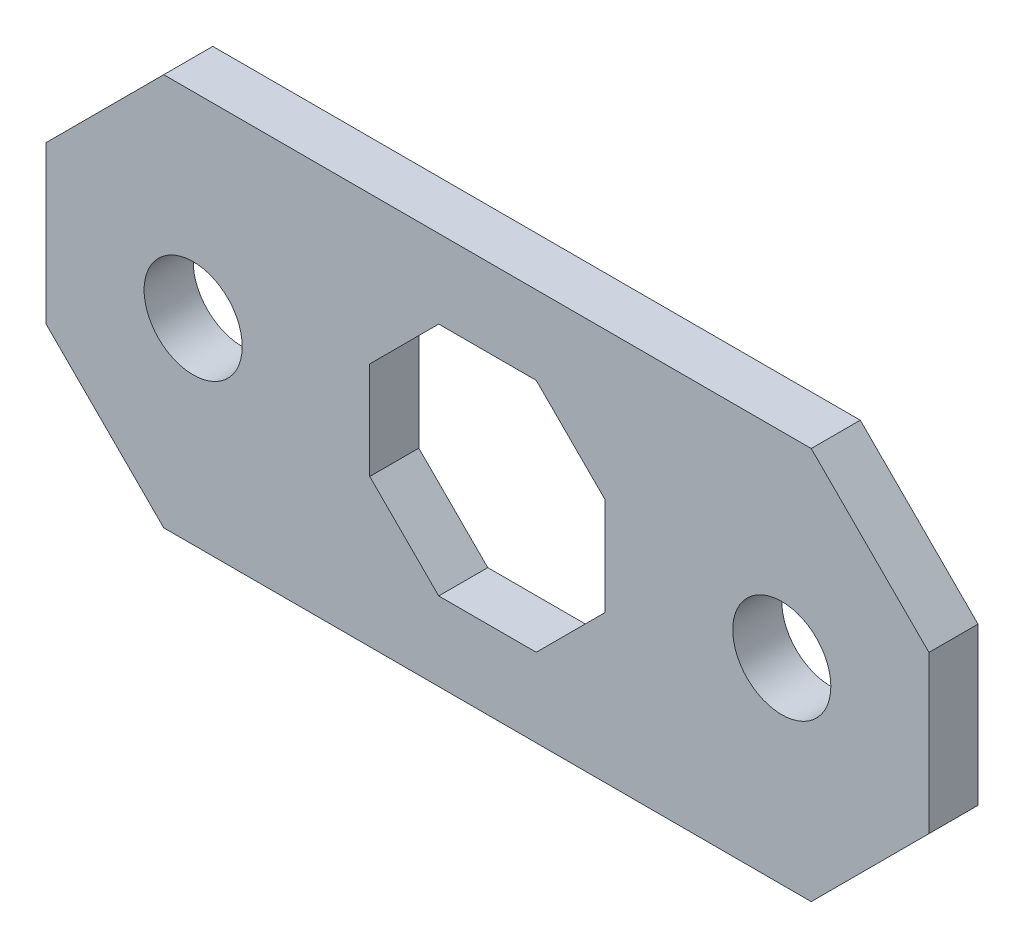
ISO-10303-21;
HEADER;
FILE_DESCRIPTION(('STEP AP214'),'2;1');
FILE_NAME('part.step','',(''),(''),'','','');
FILE_SCHEMA(('AUTOMOTIVE_DESIGN { 1 0 10303 214 1 1 1 1 }'));
ENDSEC;
DATA;
#1=APPLICATION_CONTEXT('core data for automotive mechanical design processes');
#2=APPLICATION_PROTOCOL_DEFINITION('international standard','automotive_design',2000,#1);
#3=PRODUCT_CONTEXT('',#1,'mechanical');
#4=PRODUCT('Part','Part','',(#3));
#5=PRODUCT_RELATED_PRODUCT_CATEGORY('part','',(#4));
#6=PRODUCT_DEFINITION_FORMATION('','',#4);
#7=PRODUCT_DEFINITION_CONTEXT('part definition',#1,'design');
#8=PRODUCT_DEFINITION('design','',#6,#7);
#9=PRODUCT_DEFINITION_SHAPE('','',#8);
#10=(LENGTH_UNIT() NAMED_UNIT(*) SI_UNIT(.MILLI.,.METRE.));
#11=(NAMED_UNIT(*) PLANE_ANGLE_UNIT() SI_UNIT($,.RADIAN.));
#12=(NAMED_UNIT(*) SI_UNIT($,.STERADIAN.) SOLID_ANGLE_UNIT());
#13=UNCERTAINTY_MEASURE_WITH_UNIT(LENGTH_MEASURE(1.E-05),#10,'distance_accuracy_value','');
#14=(GEOMETRIC_REPRESENTATION_CONTEXT(3) GLOBAL_UNCERTAINTY_ASSIGNED_CONTEXT((#13)) GLOBAL_UNIT_ASSIGNED_CONTEXT((#10,
#11,#12)) REPRESENTATION_CONTEXT('',''));
#15=CARTESIAN_POINT('',(0.,0.,0.));
#16=DIRECTION('',(0.,0.,1.));
#17=DIRECTION('',(1.,0.,0.));
#18=AXIS2_PLACEMENT_3D('',#15,#16,#17);
#19=CARTESIAN_POINT('',(28.575,-12.7,3.175));
#20=DIRECTION('',(-1.,0.,0.));
#21=DIRECTION('',(0.,0.,1.));
#22=AXIS2_PLACEMENT_3D('',#19,#20,#21);
#23=PLANE('',#22);
#24=DIRECTION('',(0.,1.,0.));
#25=VECTOR('',#24,1.);
#26=CARTESIAN_POINT('',(28.575,-12.7,3.175));
#27=LINE('',#26,#25);
#28=CARTESIAN_POINT('',(28.575,-5.08,3.175));
#29=VERTEX_POINT('',#28);
#30=CARTESIAN_POINT('',(28.575,5.07999999999997,3.175));
#31=VERTEX_POINT('',#30);
#32=EDGE_CURVE('E226',#29,#31,#27,.T.);
#33=ORIENTED_EDGE('',*,*,#32,.F.);
#34=DIRECTION('',(0.,0.,-1.));
#35=VECTOR('',#34,1.);
#36=CARTESIAN_POINT('',(28.575,-5.08,3.175));
#37=LINE('',#36,#35);
#38=CARTESIAN_POINT('',(28.575,-5.07999999999999,0.));
#39=VERTEX_POINT('',#38);
#40=EDGE_CURVE('E11',#29,#39,#37,.T.);
#41=ORIENTED_EDGE('',*,*,#40,.T.);
#42=DIRECTION('',(0.,1.,0.));
#43=VECTOR('',#42,1.);
#44=CARTESIAN_POINT('',(28.575,-12.7,0.));
#45=LINE('',#44,#43);
#46=CARTESIAN_POINT('',(28.575,5.07999999999996,0.));
#47=VERTEX_POINT('',#46);
#48=EDGE_CURVE('E225',#39,#47,#45,.T.);
#49=ORIENTED_EDGE('',*,*,#48,.T.);
#50=DIRECTION('',(0.,0.,1.));
#51=VECTOR('',#50,1.);
#52=CARTESIAN_POINT('',(28.575,5.07999999999996,3.175));
#53=LINE('',#52,#51);
#54=EDGE_CURVE('E40',#47,#31,#53,.T.);
#55=ORIENTED_EDGE('',*,*,#54,.T.);
#56=EDGE_LOOP('',(#33,#41,#49,#55));
#57=FACE_BOUND('',#56,.T.);
#58=ADVANCED_FACE('F32',(#57),#23,.F.);
#59=CARTESIAN_POINT('',(-28.575,12.7,3.175));
#60=DIRECTION('',(0.,-1.,0.));
#61=DIRECTION('',(0.,0.,-1.));
#62=AXIS2_PLACEMENT_3D('',#59,#60,#61);
#63=PLANE('',#62);
#64=DIRECTION('',(-1.,0.,0.));
#65=VECTOR('',#64,1.);
#66=CARTESIAN_POINT('',(-28.575,12.7,0.));
#67=LINE('',#66,#65);
#68=CARTESIAN_POINT('',(20.955,12.7,0.));
#69=VERTEX_POINT('',#68);
#70=CARTESIAN_POINT('',(-20.955,12.7,0.));
#71=VERTEX_POINT('',#70);
#72=EDGE_CURVE('E242',#69,#71,#67,.T.);
#73=ORIENTED_EDGE('',*,*,#72,.T.);
#74=DIRECTION('',(0.,0.,1.));
#75=VECTOR('',#74,1.);
#76=CARTESIAN_POINT('',(-20.955,12.7,3.175));
#77=LINE('',#76,#75);
#78=CARTESIAN_POINT('',(-20.955,12.7,3.175));
#79=VERTEX_POINT('',#78);
#80=EDGE_CURVE('E265',#71,#79,#77,.T.);
#81=ORIENTED_EDGE('',*,*,#80,.T.);
#82=DIRECTION('',(-1.,0.,0.));
#83=VECTOR('',#82,1.);
#84=CARTESIAN_POINT('',(-28.575,12.7,3.175));
#85=LINE('',#84,#83);
#86=CARTESIAN_POINT('',(20.955,12.7,3.175));
#87=VERTEX_POINT('',#86);
#88=EDGE_CURVE('E229',#87,#79,#85,.T.);
#89=ORIENTED_EDGE('',*,*,#88,.F.);
#90=DIRECTION('',(0.,0.,-1.));
#91=VECTOR('',#90,1.);
#92=CARTESIAN_POINT('',(20.955,12.7,3.175));
#93=LINE('',#92,#91);
#94=EDGE_CURVE('E262',#87,#69,#93,.T.);
#95=ORIENTED_EDGE('',*,*,#94,.T.);
#96=EDGE_LOOP('',(#73,#81,#89,#95));
#97=FACE_BOUND('',#96,.T.);
#98=ADVANCED_FACE('F293',(#97),#63,.F.);
#99=CARTESIAN_POINT('',(-28.575,-12.7,3.175));
#100=DIRECTION('',(1.,0.,0.));
#101=DIRECTION('',(0.,0.,-1.));
#102=AXIS2_PLACEMENT_3D('',#99,#100,#101);
#103=PLANE('',#102);
#104=DIRECTION('',(0.,-1.,0.));
#105=VECTOR('',#104,1.);
#106=CARTESIAN_POINT('',(-28.575,-12.7,3.175));
#107=LINE('',#106,#105);
#108=CARTESIAN_POINT('',(-28.575,5.08,3.175));
#109=VERTEX_POINT('',#108);
#110=CARTESIAN_POINT('',(-28.575,-5.07999999999996,3.175));
#111=VERTEX_POINT('',#110);
#112=EDGE_CURVE('E233',#109,#111,#107,.T.);
#113=ORIENTED_EDGE('',*,*,#112,.F.);
#114=DIRECTION('',(0.,0.,-1.));
#115=VECTOR('',#114,1.);
#116=CARTESIAN_POINT('',(-28.575,5.08,3.175));
#117=LINE('',#116,#115);
#118=CARTESIAN_POINT('',(-28.575,5.08,0.));
#119=VERTEX_POINT('',#118);
#120=EDGE_CURVE('E251',#109,#119,#117,.T.);
#121=ORIENTED_EDGE('',*,*,#120,.T.);
#122=DIRECTION('',(0.,-1.,0.));
#123=VECTOR('',#122,1.);
#124=CARTESIAN_POINT('',(-28.575,-12.7,0.));
#125=LINE('',#124,#123);
#126=CARTESIAN_POINT('',(-28.575,-5.07999999999996,0.));
#127=VERTEX_POINT('',#126);
#128=EDGE_CURVE('E245',#119,#127,#125,.T.);
#129=ORIENTED_EDGE('',*,*,#128,.T.);
#130=DIRECTION('',(0.,0.,1.));
#131=VECTOR('',#130,1.);
#132=CARTESIAN_POINT('',(-28.575,-5.07999999999996,3.175));
#133=LINE('',#132,#131);
#134=EDGE_CURVE('E239',#127,#111,#133,.T.);
#135=ORIENTED_EDGE('',*,*,#134,.T.);
#136=EDGE_LOOP('',(#113,#121,#129,#135));
#137=FACE_BOUND('',#136,.T.);
#138=ADVANCED_FACE('F303',(#137),#103,.F.);
#139=CARTESIAN_POINT('',(-28.575,-12.7,3.175));
#140=DIRECTION('',(0.,1.,0.));
#141=DIRECTION('',(0.,0.,1.));
#142=AXIS2_PLACEMENT_3D('',#139,#140,#141);
#143=PLANE('',#142);
#144=DIRECTION('',(1.,0.,0.));
#145=VECTOR('',#144,1.);
#146=CARTESIAN_POINT('',(-28.575,-12.7,3.175));
#147=LINE('',#146,#145);
#148=CARTESIAN_POINT('',(-20.955,-12.7,3.175));
#149=VERTEX_POINT('',#148);
#150=CARTESIAN_POINT('',(20.955,-12.7,3.175));
#151=VERTEX_POINT('',#150);
#152=EDGE_CURVE('E236',#149,#151,#147,.T.);
#153=ORIENTED_EDGE('',*,*,#152,.F.);
#154=DIRECTION('',(0.,0.,-1.));
#155=VECTOR('',#154,1.);
#156=CARTESIAN_POINT('',(-20.955,-12.7,3.175));
#157=LINE('',#156,#155);
#158=CARTESIAN_POINT('',(-20.955,-12.7,0.));
#159=VERTEX_POINT('',#158);
#160=EDGE_CURVE('E277',#149,#159,#157,.T.);
#161=ORIENTED_EDGE('',*,*,#160,.T.);
#162=DIRECTION('',(1.,0.,0.));
#163=VECTOR('',#162,1.);
#164=CARTESIAN_POINT('',(-28.575,-12.7,0.));
#165=LINE('',#164,#163);
#166=CARTESIAN_POINT('',(20.955,-12.7,0.));
#167=VERTEX_POINT('',#166);
#168=EDGE_CURVE('E230',#159,#167,#165,.T.);
#169=ORIENTED_EDGE('',*,*,#168,.T.);
#170=DIRECTION('',(0.,0.,1.));
#171=VECTOR('',#170,1.);
#172=CARTESIAN_POINT('',(20.955,-12.7,3.175));
#173=LINE('',#172,#171);
#174=EDGE_CURVE('E275',#167,#151,#173,.T.);
#175=ORIENTED_EDGE('',*,*,#174,.T.);
#176=EDGE_LOOP('',(#153,#161,#169,#175));
#177=FACE_BOUND('',#176,.T.);
#178=ADVANCED_FACE('F312',(#177),#143,.F.);
#179=CARTESIAN_POINT('',(0.,0.,3.175));
#180=DIRECTION('',(0.,0.,-1.));
#181=DIRECTION('',(-1.,0.,0.));
#182=AXIS2_PLACEMENT_3D('',#179,#180,#181);
#183=PLANE('',#182);
#184=DIRECTION('',(-0.707106781186548,0.707106781186547,0.));
#185=VECTOR('',#184,1.);
#186=CARTESIAN_POINT('',(7.62,3.15630734528299,3.175));
#187=LINE('',#186,#185);
#188=CARTESIAN_POINT('',(7.62,3.15630734528299,3.175));
#189=VERTEX_POINT('',#188);
#190=CARTESIAN_POINT('',(3.15630734528298,7.62000000000001,3.175));
#191=VERTEX_POINT('',#190);
#192=EDGE_CURVE('E184',#189,#191,#187,.T.);
#193=ORIENTED_EDGE('',*,*,#192,.F.);
#194=DIRECTION('',(0.,1.,0.));
#195=VECTOR('',#194,1.);
#196=CARTESIAN_POINT('',(7.62,-3.15630734528299,3.175));
#197=LINE('',#196,#195);
#198=CARTESIAN_POINT('',(7.62,-3.15630734528299,3.175));
#199=VERTEX_POINT('',#198);
#200=EDGE_CURVE('E47',#199,#189,#197,.T.);
#201=ORIENTED_EDGE('',*,*,#200,.F.);
#202=DIRECTION('',(0.707106781186548,0.707106781186547,0.));
#203=VECTOR('',#202,1.);
#204=CARTESIAN_POINT('',(3.15630734528299,-7.62,3.175));
#205=LINE('',#204,#203);
#206=CARTESIAN_POINT('',(3.15630734528299,-7.62,3.175));
#207=VERTEX_POINT('',#206);
#208=EDGE_CURVE('E164',#207,#199,#205,.T.);
#209=ORIENTED_EDGE('',*,*,#208,.F.);
#210=DIRECTION('',(1.,0.,0.));
#211=VECTOR('',#210,1.);
#212=CARTESIAN_POINT('',(-3.15630734528299,-7.62,3.175));
#213=LINE('',#212,#211);
#214=CARTESIAN_POINT('',(-3.15630734528299,-7.62,3.175));
#215=VERTEX_POINT('',#214);
#216=EDGE_CURVE('E167',#215,#207,#213,.T.);
#217=ORIENTED_EDGE('',*,*,#216,.F.);
#218=DIRECTION('',(0.707106781186547,-0.707106781186548,0.));
#219=VECTOR('',#218,1.);
#220=CARTESIAN_POINT('',(-7.62,-3.15630734528299,3.175));
#221=LINE('',#220,#219);
#222=CARTESIAN_POINT('',(-7.62,-3.15630734528299,3.175));
#223=VERTEX_POINT('',#222);
#224=EDGE_CURVE('E195',#223,#215,#221,.T.);
#225=ORIENTED_EDGE('',*,*,#224,.F.);
#226=DIRECTION('',(0.,-1.,0.));
#227=VECTOR('',#226,1.);
#228=CARTESIAN_POINT('',(-7.62000000000001,3.15630734528299,3.175));
#229=LINE('',#228,#227);
#230=CARTESIAN_POINT('',(-7.62000000000001,3.15630734528299,3.175));
#231=VERTEX_POINT('',#230);
#232=EDGE_CURVE('E192',#231,#223,#229,.T.);
#233=ORIENTED_EDGE('',*,*,#232,.F.);
#234=DIRECTION('',(-0.707106781186547,-0.707106781186548,0.));
#235=VECTOR('',#234,1.);
#236=CARTESIAN_POINT('',(-3.15630734528299,7.62,3.175));
#237=LINE('',#236,#235);
#238=CARTESIAN_POINT('',(-3.15630734528299,7.62,3.175));
#239=VERTEX_POINT('',#238);
#240=EDGE_CURVE('E189',#239,#231,#237,.T.);
#241=ORIENTED_EDGE('',*,*,#240,.F.);
#242=DIRECTION('',(-1.,0.,0.));
#243=VECTOR('',#242,1.);
#244=CARTESIAN_POINT('',(3.15630734528298,7.62000000000001,3.175));
#245=LINE('',#244,#243);
#246=EDGE_CURVE('E186',#191,#239,#245,.T.);
#247=ORIENTED_EDGE('',*,*,#246,.F.);
#248=EDGE_LOOP('',(#193,#201,#209,#217,#225,#233,#241,#247));
#249=FACE_BOUND('',#248,.T.);
#250=CARTESIAN_POINT('',(-19.05,0.,3.175));
#251=DIRECTION('',(0.,0.,1.));
#252=DIRECTION('',(1.,0.,0.));
#253=AXIS2_PLACEMENT_3D('',#250,#251,#252);
#254=CIRCLE('',#253,3.17500000000001);
#255=CARTESIAN_POINT('',(-15.875,0.,3.175));
#256=VERTEX_POINT('',#255);
#257=EDGE_CURVE('E202',#256,#256,#254,.T.);
#258=ORIENTED_EDGE('',*,*,#257,.F.);
#259=EDGE_LOOP('',(#258));
#260=FACE_BOUND('',#259,.T.);
#261=CARTESIAN_POINT('',(19.05,0.,3.175));
#262=DIRECTION('',(0.,0.,1.));
#263=DIRECTION('',(1.,0.,0.));
#264=AXIS2_PLACEMENT_3D('',#261,#262,#263);
#265=CIRCLE('',#264,3.17500000000001);
#266=CARTESIAN_POINT('',(22.225,0.,3.175));
#267=VERTEX_POINT('',#266);
#268=EDGE_CURVE('E219',#267,#267,#265,.T.);
#269=ORIENTED_EDGE('',*,*,#268,.F.);
#270=EDGE_LOOP('',(#269));
#271=FACE_BOUND('',#270,.T.);
#272=ORIENTED_EDGE('',*,*,#88,.T.);
#273=DIRECTION('',(0.707106781186549,0.707106781186546,0.));
#274=VECTOR('',#273,1.);
#275=CARTESIAN_POINT('',(-28.575,5.08,3.175));
#276=LINE('',#275,#274);
#277=EDGE_CURVE('E273',#79,#109,#276,.F.);
#278=ORIENTED_EDGE('',*,*,#277,.T.);
#279=ORIENTED_EDGE('',*,*,#112,.T.);
#280=DIRECTION('',(-0.707106781186546,0.707106781186549,0.));
#281=VECTOR('',#280,1.);
#282=CARTESIAN_POINT('',(-20.955,-12.7,3.175));
#283=LINE('',#282,#281);
#284=EDGE_CURVE('E271',#111,#149,#283,.F.);
#285=ORIENTED_EDGE('',*,*,#284,.T.);
#286=ORIENTED_EDGE('',*,*,#152,.T.);
#287=DIRECTION('',(-0.707106781186549,-0.707106781186546,0.));
#288=VECTOR('',#287,1.);
#289=CARTESIAN_POINT('',(28.575,-5.08,3.175));
#290=LINE('',#289,#288);
#291=EDGE_CURVE('E269',#151,#29,#290,.F.);
#292=ORIENTED_EDGE('',*,*,#291,.T.);
#293=ORIENTED_EDGE('',*,*,#32,.T.);
#294=DIRECTION('',(0.707106781186546,-0.707106781186549,0.));
#295=VECTOR('',#294,1.);
#296=CARTESIAN_POINT('',(20.955,12.7,3.175));
#297=LINE('',#296,#295);
#298=EDGE_CURVE('E267',#31,#87,#297,.F.);
#299=ORIENTED_EDGE('',*,*,#298,.T.);
#300=EDGE_LOOP('',(#272,#278,#279,#285,#286,#292,#293,#299));
#301=FACE_BOUND('',#300,.T.);
#302=ADVANCED_FACE('F287',(#249,#260,#271,#301),#183,.F.);
#303=CARTESIAN_POINT('',(0.,0.,0.));
#304=DIRECTION('',(0.,0.,-1.));
#305=DIRECTION('',(-1.,0.,0.));
#306=AXIS2_PLACEMENT_3D('',#303,#304,#305);
#307=PLANE('',#306);
#308=DIRECTION('',(0.,1.,0.));
#309=VECTOR('',#308,1.);
#310=CARTESIAN_POINT('',(7.62,-3.15630734528299,0.));
#311=LINE('',#310,#309);
#312=CARTESIAN_POINT('',(7.62,-3.15630734528299,0.));
#313=VERTEX_POINT('',#312);
#314=CARTESIAN_POINT('',(7.62,3.15630734528299,0.));
#315=VERTEX_POINT('',#314);
#316=EDGE_CURVE('E147',#313,#315,#311,.T.);
#317=ORIENTED_EDGE('',*,*,#316,.T.);
#318=DIRECTION('',(-0.707106781186548,0.707106781186547,0.));
#319=VECTOR('',#318,1.);
#320=CARTESIAN_POINT('',(7.62,3.15630734528299,0.));
#321=LINE('',#320,#319);
#322=CARTESIAN_POINT('',(3.15630734528298,7.62000000000001,0.));
#323=VERTEX_POINT('',#322);
#324=EDGE_CURVE('E156',#315,#323,#321,.T.);
#325=ORIENTED_EDGE('',*,*,#324,.T.);
#326=DIRECTION('',(-1.,0.,0.));
#327=VECTOR('',#326,1.);
#328=CARTESIAN_POINT('',(3.15630734528298,7.62000000000001,0.));
#329=LINE('',#328,#327);
#330=CARTESIAN_POINT('',(-3.15630734528299,7.62,0.));
#331=VERTEX_POINT('',#330);
#332=EDGE_CURVE('E55',#323,#331,#329,.T.);
#333=ORIENTED_EDGE('',*,*,#332,.T.);
#334=DIRECTION('',(-0.707106781186547,-0.707106781186548,0.));
#335=VECTOR('',#334,1.);
#336=CARTESIAN_POINT('',(-3.15630734528299,7.62,0.));
#337=LINE('',#336,#335);
#338=CARTESIAN_POINT('',(-7.62000000000001,3.15630734528299,0.));
#339=VERTEX_POINT('',#338);
#340=EDGE_CURVE('E171',#331,#339,#337,.T.);
#341=ORIENTED_EDGE('',*,*,#340,.T.);
#342=DIRECTION('',(0.,-1.,0.));
#343=VECTOR('',#342,1.);
#344=CARTESIAN_POINT('',(-7.62000000000001,3.15630734528299,0.));
#345=LINE('',#344,#343);
#346=CARTESIAN_POINT('',(-7.62,-3.15630734528299,0.));
#347=VERTEX_POINT('',#346);
#348=EDGE_CURVE('E174',#339,#347,#345,.T.);
#349=ORIENTED_EDGE('',*,*,#348,.T.);
#350=DIRECTION('',(0.707106781186547,-0.707106781186548,0.));
#351=VECTOR('',#350,1.);
#352=CARTESIAN_POINT('',(-7.62,-3.15630734528299,0.));
#353=LINE('',#352,#351);
#354=CARTESIAN_POINT('',(-3.15630734528299,-7.62,0.));
#355=VERTEX_POINT('',#354);
#356=EDGE_CURVE('E177',#347,#355,#353,.T.);
#357=ORIENTED_EDGE('',*,*,#356,.T.);
#358=DIRECTION('',(1.,0.,0.));
#359=VECTOR('',#358,1.);
#360=CARTESIAN_POINT('',(-3.15630734528299,-7.62,0.));
#361=LINE('',#360,#359);
#362=CARTESIAN_POINT('',(3.15630734528299,-7.62,0.));
#363=VERTEX_POINT('',#362);
#364=EDGE_CURVE('E180',#355,#363,#361,.T.);
#365=ORIENTED_EDGE('',*,*,#364,.T.);
#366=DIRECTION('',(0.707106781186548,0.707106781186547,0.));
#367=VECTOR('',#366,1.);
#368=CARTESIAN_POINT('',(3.15630734528299,-7.62,0.));
#369=LINE('',#368,#367);
#370=EDGE_CURVE('E153',#363,#313,#369,.T.);
#371=ORIENTED_EDGE('',*,*,#370,.T.);
#372=EDGE_LOOP('',(#317,#325,#333,#341,#349,#357,#365,#371));
#373=FACE_BOUND('',#372,.T.);
#374=CARTESIAN_POINT('',(-19.05,0.,0.));
#375=DIRECTION('',(0.,0.,1.));
#376=DIRECTION('',(1.,0.,0.));
#377=AXIS2_PLACEMENT_3D('',#374,#375,#376);
#378=CIRCLE('',#377,3.17500000000001);
#379=CARTESIAN_POINT('',(-15.875,0.,0.));
#380=VERTEX_POINT('',#379);
#381=EDGE_CURVE('E216',#380,#380,#378,.T.);
#382=ORIENTED_EDGE('',*,*,#381,.T.);
#383=EDGE_LOOP('',(#382));
#384=FACE_BOUND('',#383,.T.);
#385=CARTESIAN_POINT('',(19.05,0.,0.));
#386=DIRECTION('',(0.,0.,1.));
#387=DIRECTION('',(1.,0.,0.));
#388=AXIS2_PLACEMENT_3D('',#385,#386,#387);
#389=CIRCLE('',#388,3.17500000000001);
#390=CARTESIAN_POINT('',(22.225,0.,0.));
#391=VERTEX_POINT('',#390);
#392=EDGE_CURVE('E222',#391,#391,#389,.T.);
#393=ORIENTED_EDGE('',*,*,#392,.T.);
#394=EDGE_LOOP('',(#393));
#395=FACE_BOUND('',#394,.T.);
#396=ORIENTED_EDGE('',*,*,#128,.F.);
#397=DIRECTION('',(-0.707106781186549,-0.707106781186546,0.));
#398=VECTOR('',#397,1.);
#399=CARTESIAN_POINT('',(-16.8274999999999,16.8275,0.));
#400=LINE('',#399,#398);
#401=EDGE_CURVE('E260',#119,#71,#400,.F.);
#402=ORIENTED_EDGE('',*,*,#401,.T.);
#403=ORIENTED_EDGE('',*,*,#72,.F.);
#404=DIRECTION('',(-0.707106781186546,0.707106781186549,0.));
#405=VECTOR('',#404,1.);
#406=CARTESIAN_POINT('',(16.8275,16.8275,0.));
#407=LINE('',#406,#405);
#408=EDGE_CURVE('E254',#69,#47,#407,.F.);
#409=ORIENTED_EDGE('',*,*,#408,.T.);
#410=ORIENTED_EDGE('',*,*,#48,.F.);
#411=DIRECTION('',(0.707106781186549,0.707106781186546,0.));
#412=VECTOR('',#411,1.);
#413=CARTESIAN_POINT('',(16.8274999999999,-16.8275,0.));
#414=LINE('',#413,#412);
#415=EDGE_CURVE('E256',#39,#167,#414,.F.);
#416=ORIENTED_EDGE('',*,*,#415,.T.);
#417=ORIENTED_EDGE('',*,*,#168,.F.);
#418=DIRECTION('',(0.707106781186546,-0.707106781186549,0.));
#419=VECTOR('',#418,1.);
#420=CARTESIAN_POINT('',(-16.8275,-16.8275,0.));
#421=LINE('',#420,#419);
#422=EDGE_CURVE('E258',#159,#127,#421,.F.);
#423=ORIENTED_EDGE('',*,*,#422,.T.);
#424=EDGE_LOOP('',(#396,#402,#403,#409,#410,#416,#417,#423));
#425=FACE_BOUND('',#424,.T.);
#426=ADVANCED_FACE('F160',(#373,#384,#395,#425),#307,.T.);
#427=CARTESIAN_POINT('',(19.05,0.,3.175));
#428=DIRECTION('',(0.,0.,1.));
#429=DIRECTION('',(1.,0.,0.));
#430=AXIS2_PLACEMENT_3D('',#427,#428,#429);
#431=CYLINDRICAL_SURFACE('',#430,3.17500000000001);
#432=ORIENTED_EDGE('',*,*,#392,.F.);
#433=EDGE_LOOP('',(#432));
#434=FACE_BOUND('',#433,.T.);
#435=ORIENTED_EDGE('',*,*,#268,.T.);
#436=EDGE_LOOP('',(#435));
#437=FACE_BOUND('',#436,.T.);
#438=ADVANCED_FACE('F335',(#434,#437),#431,.F.);
#439=CARTESIAN_POINT('',(-19.05,0.,3.175));
#440=DIRECTION('',(0.,0.,1.));
#441=DIRECTION('',(1.,0.,0.));
#442=AXIS2_PLACEMENT_3D('',#439,#440,#441);
#443=CYLINDRICAL_SURFACE('',#442,3.17500000000001);
#444=ORIENTED_EDGE('',*,*,#381,.F.);
#445=EDGE_LOOP('',(#444));
#446=FACE_BOUND('',#445,.T.);
#447=ORIENTED_EDGE('',*,*,#257,.T.);
#448=EDGE_LOOP('',(#447));
#449=FACE_BOUND('',#448,.T.);
#450=ADVANCED_FACE('F331',(#446,#449),#443,.F.);
#451=CARTESIAN_POINT('',(-28.575,5.08,3.175));
#452=DIRECTION('',(0.707106781186546,-0.707106781186549,0.));
#453=DIRECTION('',(0.,0.,-1.));
#454=AXIS2_PLACEMENT_3D('',#451,#452,#453);
#455=PLANE('',#454);
#456=ORIENTED_EDGE('',*,*,#277,.F.);
#457=ORIENTED_EDGE('',*,*,#80,.F.);
#458=ORIENTED_EDGE('',*,*,#401,.F.);
#459=ORIENTED_EDGE('',*,*,#120,.F.);
#460=EDGE_LOOP('',(#456,#457,#458,#459));
#461=FACE_BOUND('',#460,.T.);
#462=ADVANCED_FACE('F300',(#461),#455,.F.);
#463=CARTESIAN_POINT('',(-20.955,-12.7,3.175));
#464=DIRECTION('',(0.707106781186549,0.707106781186546,0.));
#465=DIRECTION('',(0.,0.,-1.));
#466=AXIS2_PLACEMENT_3D('',#463,#464,#465);
#467=PLANE('',#466);
#468=ORIENTED_EDGE('',*,*,#284,.F.);
#469=ORIENTED_EDGE('',*,*,#134,.F.);
#470=ORIENTED_EDGE('',*,*,#422,.F.);
#471=ORIENTED_EDGE('',*,*,#160,.F.);
#472=EDGE_LOOP('',(#468,#469,#470,#471));
#473=FACE_BOUND('',#472,.T.);
#474=ADVANCED_FACE('F309',(#473),#467,.F.);
#475=CARTESIAN_POINT('',(28.575,-5.08,3.175));
#476=DIRECTION('',(-0.707106781186546,0.707106781186549,0.));
#477=DIRECTION('',(0.,0.,-1.));
#478=AXIS2_PLACEMENT_3D('',#475,#476,#477);
#479=PLANE('',#478);
#480=ORIENTED_EDGE('',*,*,#291,.F.);
#481=ORIENTED_EDGE('',*,*,#174,.F.);
#482=ORIENTED_EDGE('',*,*,#415,.F.);
#483=ORIENTED_EDGE('',*,*,#40,.F.);
#484=EDGE_LOOP('',(#480,#481,#482,#483));
#485=FACE_BOUND('',#484,.T.);
#486=ADVANCED_FACE('F315',(#485),#479,.F.);
#487=CARTESIAN_POINT('',(20.955,12.7,3.175));
#488=DIRECTION('',(-0.707106781186549,-0.707106781186546,0.));
#489=DIRECTION('',(0.,0.,-1.));
#490=AXIS2_PLACEMENT_3D('',#487,#488,#489);
#491=PLANE('',#490);
#492=ORIENTED_EDGE('',*,*,#298,.F.);
#493=ORIENTED_EDGE('',*,*,#54,.F.);
#494=ORIENTED_EDGE('',*,*,#408,.F.);
#495=ORIENTED_EDGE('',*,*,#94,.F.);
#496=EDGE_LOOP('',(#492,#493,#494,#495));
#497=FACE_BOUND('',#496,.T.);
#498=ADVANCED_FACE('F34',(#497),#491,.F.);
#499=CARTESIAN_POINT('',(7.62,-3.15630734528299,0.));
#500=DIRECTION('',(1.,0.,0.));
#501=DIRECTION('',(0.,1.,0.));
#502=AXIS2_PLACEMENT_3D('',#499,#500,#501);
#503=PLANE('',#502);
#504=ORIENTED_EDGE('',*,*,#200,.T.);
#505=DIRECTION('',(0.,0.,1.));
#506=VECTOR('',#505,1.);
#507=CARTESIAN_POINT('',(7.62,3.15630734528299,0.));
#508=LINE('',#507,#506);
#509=EDGE_CURVE('E143',#315,#189,#508,.T.);
#510=ORIENTED_EDGE('',*,*,#509,.F.);
#511=ORIENTED_EDGE('',*,*,#316,.F.);
#512=DIRECTION('',(0.,0.,1.));
#513=VECTOR('',#512,1.);
#514=CARTESIAN_POINT('',(7.62,-3.15630734528299,0.));
#515=LINE('',#514,#513);
#516=EDGE_CURVE('E200',#313,#199,#515,.T.);
#517=ORIENTED_EDGE('',*,*,#516,.T.);
#518=EDGE_LOOP('',(#504,#510,#511,#517));
#519=FACE_BOUND('',#518,.T.);
#520=ADVANCED_FACE('F145',(#519),#503,.F.);
#521=CARTESIAN_POINT('',(3.15630734528299,-7.62,0.));
#522=DIRECTION('',(0.707106781186547,-0.707106781186548,0.));
#523=DIRECTION('',(0.707106781186548,0.707106781186547,0.));
#524=AXIS2_PLACEMENT_3D('',#521,#522,#523);
#525=PLANE('',#524);
#526=ORIENTED_EDGE('',*,*,#208,.T.);
#527=ORIENTED_EDGE('',*,*,#516,.F.);
#528=ORIENTED_EDGE('',*,*,#370,.F.);
#529=DIRECTION('',(0.,0.,1.));
#530=VECTOR('',#529,1.);
#531=CARTESIAN_POINT('',(3.15630734528299,-7.62,0.));
#532=LINE('',#531,#530);
#533=EDGE_CURVE('E203',#363,#207,#532,.T.);
#534=ORIENTED_EDGE('',*,*,#533,.T.);
#535=EDGE_LOOP('',(#526,#527,#528,#534));
#536=FACE_BOUND('',#535,.T.);
#537=ADVANCED_FACE('F423',(#536),#525,.F.);
#538=CARTESIAN_POINT('',(-3.15630734528299,-7.62,0.));
#539=DIRECTION('',(0.,-1.,0.));
#540=DIRECTION('',(1.,0.,0.));
#541=AXIS2_PLACEMENT_3D('',#538,#539,#540);
#542=PLANE('',#541);
#543=ORIENTED_EDGE('',*,*,#216,.T.);
#544=ORIENTED_EDGE('',*,*,#533,.F.);
#545=ORIENTED_EDGE('',*,*,#364,.F.);
#546=DIRECTION('',(0.,0.,1.));
#547=VECTOR('',#546,1.);
#548=CARTESIAN_POINT('',(-3.15630734528299,-7.62,0.));
#549=LINE('',#548,#547);
#550=EDGE_CURVE('E205',#355,#215,#549,.T.);
#551=ORIENTED_EDGE('',*,*,#550,.T.);
#552=EDGE_LOOP('',(#543,#544,#545,#551));
#553=FACE_BOUND('',#552,.T.);
#554=ADVANCED_FACE('F430',(#553),#542,.F.);
#555=CARTESIAN_POINT('',(-7.62,-3.15630734528299,0.));
#556=DIRECTION('',(-0.707106781186548,-0.707106781186547,0.));
#557=DIRECTION('',(0.707106781186547,-0.707106781186548,0.));
#558=AXIS2_PLACEMENT_3D('',#555,#556,#557);
#559=PLANE('',#558);
#560=ORIENTED_EDGE('',*,*,#224,.T.);
#561=ORIENTED_EDGE('',*,*,#550,.F.);
#562=ORIENTED_EDGE('',*,*,#356,.F.);
#563=DIRECTION('',(0.,0.,1.));
#564=VECTOR('',#563,1.);
#565=CARTESIAN_POINT('',(-7.62,-3.15630734528299,0.));
#566=LINE('',#565,#564);
#567=EDGE_CURVE('E207',#347,#223,#566,.T.);
#568=ORIENTED_EDGE('',*,*,#567,.T.);
#569=EDGE_LOOP('',(#560,#561,#562,#568));
#570=FACE_BOUND('',#569,.T.);
#571=ADVANCED_FACE('F439',(#570),#559,.F.);
#572=CARTESIAN_POINT('',(-7.62000000000001,3.15630734528299,0.));
#573=DIRECTION('',(-1.,0.,0.));
#574=DIRECTION('',(0.,-1.,0.));
#575=AXIS2_PLACEMENT_3D('',#572,#573,#574);
#576=PLANE('',#575);
#577=ORIENTED_EDGE('',*,*,#232,.T.);
#578=ORIENTED_EDGE('',*,*,#567,.F.);
#579=ORIENTED_EDGE('',*,*,#348,.F.);
#580=DIRECTION('',(0.,0.,1.));
#581=VECTOR('',#580,1.);
#582=CARTESIAN_POINT('',(-7.62000000000001,3.15630734528299,0.));
#583=LINE('',#582,#581);
#584=EDGE_CURVE('E209',#339,#231,#583,.T.);
#585=ORIENTED_EDGE('',*,*,#584,.T.);
#586=EDGE_LOOP('',(#577,#578,#579,#585));
#587=FACE_BOUND('',#586,.T.);
#588=ADVANCED_FACE('F448',(#587),#576,.F.);
#589=CARTESIAN_POINT('',(-3.15630734528299,7.62,0.));
#590=DIRECTION('',(-0.707106781186548,0.707106781186547,0.));
#591=DIRECTION('',(-0.707106781186547,-0.707106781186548,0.));
#592=AXIS2_PLACEMENT_3D('',#589,#590,#591);
#593=PLANE('',#592);
#594=ORIENTED_EDGE('',*,*,#240,.T.);
#595=ORIENTED_EDGE('',*,*,#584,.F.);
#596=ORIENTED_EDGE('',*,*,#340,.F.);
#597=DIRECTION('',(0.,0.,1.));
#598=VECTOR('',#597,1.);
#599=CARTESIAN_POINT('',(-3.15630734528299,7.62,0.));
#600=LINE('',#599,#598);
#601=EDGE_CURVE('E211',#331,#239,#600,.T.);
#602=ORIENTED_EDGE('',*,*,#601,.T.);
#603=EDGE_LOOP('',(#594,#595,#596,#602));
#604=FACE_BOUND('',#603,.T.);
#605=ADVANCED_FACE('F457',(#604),#593,.F.);
#606=CARTESIAN_POINT('',(3.15630734528298,7.62000000000001,0.));
#607=DIRECTION('',(0.,1.,0.));
#608=DIRECTION('',(-1.,0.,0.));
#609=AXIS2_PLACEMENT_3D('',#606,#607,#608);
#610=PLANE('',#609);
#611=ORIENTED_EDGE('',*,*,#246,.T.);
#612=ORIENTED_EDGE('',*,*,#601,.F.);
#613=ORIENTED_EDGE('',*,*,#332,.F.);
#614=DIRECTION('',(0.,0.,1.));
#615=VECTOR('',#614,1.);
#616=CARTESIAN_POINT('',(3.15630734528298,7.62000000000001,0.));
#617=LINE('',#616,#615);
#618=EDGE_CURVE('E152',#323,#191,#617,.T.);
#619=ORIENTED_EDGE('',*,*,#618,.T.);
#620=EDGE_LOOP('',(#611,#612,#613,#619));
#621=FACE_BOUND('',#620,.T.);
#622=ADVANCED_FACE('F466',(#621),#610,.F.);
#623=CARTESIAN_POINT('',(7.62,3.15630734528299,0.));
#624=DIRECTION('',(0.707106781186547,0.707106781186548,0.));
#625=DIRECTION('',(-0.707106781186548,0.707106781186547,0.));
#626=AXIS2_PLACEMENT_3D('',#623,#624,#625);
#627=PLANE('',#626);
#628=ORIENTED_EDGE('',*,*,#192,.T.);
#629=ORIENTED_EDGE('',*,*,#618,.F.);
#630=ORIENTED_EDGE('',*,*,#324,.F.);
#631=ORIENTED_EDGE('',*,*,#509,.T.);
#632=EDGE_LOOP('',(#628,#629,#630,#631));
#633=FACE_BOUND('',#632,.T.);
#634=ADVANCED_FACE('F157',(#633),#627,.F.);
#635=CLOSED_SHELL('',(#58,#98,#138,#178,#302,#426,#438,#450,#462,#474,#486,#498,#520,#537,#554,
#571,#588,#605,#622,#634));
#636=MANIFOLD_SOLID_BREP('B2',#635);
#637=ADVANCED_BREP_SHAPE_REPRESENTATION('',(#18,#636),#14);
#638=SHAPE_DEFINITION_REPRESENTATION(#9,#637);
ENDSEC;
END-ISO-10303-21;
